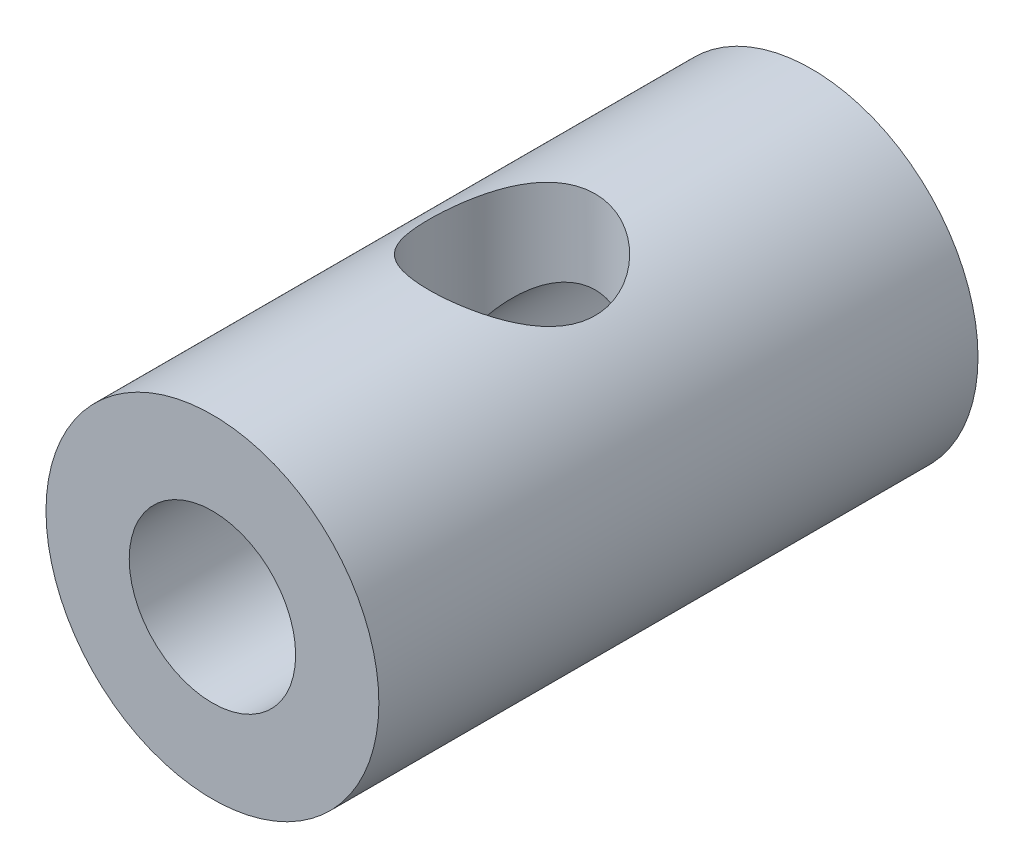
ISO-10303-21;
HEADER;
FILE_DESCRIPTION(('STEP AP214'),'2;1');
FILE_NAME('part.step','',(''),(''),'','','');
FILE_SCHEMA(('AUTOMOTIVE_DESIGN { 1 0 10303 214 1 1 1 1 }'));
ENDSEC;
DATA;
#1=APPLICATION_CONTEXT('core data for automotive mechanical design processes');
#2=APPLICATION_PROTOCOL_DEFINITION('international standard','automotive_design',2000,#1);
#3=PRODUCT_CONTEXT('',#1,'mechanical');
#4=PRODUCT('Part','Part','',(#3));
#5=PRODUCT_RELATED_PRODUCT_CATEGORY('part','',(#4));
#6=PRODUCT_DEFINITION_FORMATION('','',#4);
#7=PRODUCT_DEFINITION_CONTEXT('part definition',#1,'design');
#8=PRODUCT_DEFINITION('design','',#6,#7);
#9=PRODUCT_DEFINITION_SHAPE('','',#8);
#10=(LENGTH_UNIT() NAMED_UNIT(*) SI_UNIT(.MILLI.,.METRE.));
#11=(NAMED_UNIT(*) PLANE_ANGLE_UNIT() SI_UNIT($,.RADIAN.));
#12=(NAMED_UNIT(*) SI_UNIT($,.STERADIAN.) SOLID_ANGLE_UNIT());
#13=UNCERTAINTY_MEASURE_WITH_UNIT(LENGTH_MEASURE(1.E-05),#10,'distance_accuracy_value','');
#14=(GEOMETRIC_REPRESENTATION_CONTEXT(3) GLOBAL_UNCERTAINTY_ASSIGNED_CONTEXT((#13)) GLOBAL_UNIT_ASSIGNED_CONTEXT((#10,
#11,#12)) REPRESENTATION_CONTEXT('',''));
#15=CARTESIAN_POINT('',(0.,0.,0.));
#16=DIRECTION('',(0.,0.,1.));
#17=DIRECTION('',(1.,0.,0.));
#18=AXIS2_PLACEMENT_3D('',#15,#16,#17);
#19=CARTESIAN_POINT('',(0.,0.,90.));
#20=DIRECTION('',(0.,0.,-1.));
#21=DIRECTION('',(-1.,0.,0.));
#22=AXIS2_PLACEMENT_3D('',#19,#20,#21);
#23=CYLINDRICAL_SURFACE('',#22,25.);
#24=CARTESIAN_POINT('',(0.,0.,0.));
#25=DIRECTION('',(0.,0.707106781186548,-0.707106781186547));
#26=DIRECTION('',(0.,-0.707106781186548,-0.707106781186547));
#27=AXIS2_PLACEMENT_3D('',#24,#25,#26);
#28=ELLIPSE('',#27,35.3553390593274,25.);
#29=CARTESIAN_POINT('',(25.,0.,0.));
#30=VERTEX_POINT('',#29);
#31=CARTESIAN_POINT('',(-25.,0.,0.));
#32=VERTEX_POINT('',#31);
#33=EDGE_CURVE('E11',#30,#32,#28,.F.);
#34=ORIENTED_EDGE('',*,*,#33,.F.);
#35=CARTESIAN_POINT('',(0.,0.,0.));
#36=DIRECTION('',(0.,-0.707106781186548,-0.707106781186547));
#37=DIRECTION('',(0.,0.707106781186548,-0.707106781186547));
#38=AXIS2_PLACEMENT_3D('',#35,#36,#37);
#39=ELLIPSE('',#38,35.3553390593274,25.);
#40=EDGE_CURVE('E54',#32,#30,#39,.F.);
#41=ORIENTED_EDGE('',*,*,#40,.F.);
#42=EDGE_LOOP('',(#34,#41));
#43=FACE_BOUND('',#42,.T.);
#44=CARTESIAN_POINT('',(0.,0.,90.));
#45=DIRECTION('',(0.,0.,1.));
#46=DIRECTION('',(1.,0.,0.));
#47=AXIS2_PLACEMENT_3D('',#44,#45,#46);
#48=CIRCLE('',#47,25.);
#49=CARTESIAN_POINT('',(25.,0.,90.));
#50=VERTEX_POINT('',#49);
#51=EDGE_CURVE('E77',#50,#50,#48,.T.);
#52=ORIENTED_EDGE('',*,*,#51,.T.);
#53=EDGE_LOOP('',(#52));
#54=FACE_BOUND('',#53,.T.);
#55=ADVANCED_FACE('F39',(#43,#54),#23,.F.);
#56=CARTESIAN_POINT('',(0.,0.,90.));
#57=DIRECTION('',(0.,0.,1.));
#58=DIRECTION('',(1.,0.,0.));
#59=AXIS2_PLACEMENT_3D('',#56,#57,#58);
#60=PLANE('',#59);
#61=CARTESIAN_POINT('',(0.,0.,90.));
#62=DIRECTION('',(0.,0.,1.));
#63=DIRECTION('',(1.,0.,0.));
#64=AXIS2_PLACEMENT_3D('',#61,#62,#63);
#65=CIRCLE('',#64,50.);
#66=CARTESIAN_POINT('',(50.,0.,90.));
#67=VERTEX_POINT('',#66);
#68=EDGE_CURVE('E68',#67,#67,#65,.T.);
#69=ORIENTED_EDGE('',*,*,#68,.T.);
#70=EDGE_LOOP('',(#69));
#71=FACE_BOUND('',#70,.T.);
#72=ORIENTED_EDGE('',*,*,#51,.F.);
#73=EDGE_LOOP('',(#72));
#74=FACE_BOUND('',#73,.T.);
#75=ADVANCED_FACE('F102',(#71,#74),#60,.T.);
#76=CARTESIAN_POINT('',(0.,0.,-90.));
#77=DIRECTION('',(0.,0.,1.));
#78=DIRECTION('',(1.,0.,0.));
#79=AXIS2_PLACEMENT_3D('',#76,#77,#78);
#80=PLANE('',#79);
#81=CARTESIAN_POINT('',(0.,0.,-90.));
#82=DIRECTION('',(0.,0.,1.));
#83=DIRECTION('',(1.,0.,0.));
#84=AXIS2_PLACEMENT_3D('',#81,#82,#83);
#85=CIRCLE('',#84,50.);
#86=CARTESIAN_POINT('',(50.,0.,-90.));
#87=VERTEX_POINT('',#86);
#88=EDGE_CURVE('E74',#87,#87,#85,.T.);
#89=ORIENTED_EDGE('',*,*,#88,.F.);
#90=EDGE_LOOP('',(#89));
#91=FACE_BOUND('',#90,.T.);
#92=CARTESIAN_POINT('',(0.,0.,-90.));
#93=DIRECTION('',(0.,0.,1.));
#94=DIRECTION('',(1.,0.,0.));
#95=AXIS2_PLACEMENT_3D('',#92,#93,#94);
#96=CIRCLE('',#95,25.);
#97=CARTESIAN_POINT('',(25.,0.,-90.));
#98=VERTEX_POINT('',#97);
#99=EDGE_CURVE('E80',#98,#98,#96,.T.);
#100=ORIENTED_EDGE('',*,*,#99,.T.);
#101=EDGE_LOOP('',(#100));
#102=FACE_BOUND('',#101,.T.);
#103=ADVANCED_FACE('F104',(#91,#102),#80,.F.);
#104=CARTESIAN_POINT('',(0.,0.,90.));
#105=DIRECTION('',(0.,0.,-1.));
#106=DIRECTION('',(-1.,0.,0.));
#107=AXIS2_PLACEMENT_3D('',#104,#105,#106);
#108=CYLINDRICAL_SURFACE('',#107,50.);
#109=CARTESIAN_POINT('',(0.,-50.,25.));
#110=CARTESIAN_POINT('',(0.657444369159873,-49.9999980025819,24.9999978279489));
#111=CARTESIAN_POINT('',(1.31493470496087,-49.9870027092108,24.9740362150273));
#112=CARTESIAN_POINT('',(2.6250730777355,-49.9353488385963,24.8704854379624));
#113=CARTESIAN_POINT('',(3.27771888320609,-49.8966790970169,24.7928738141757));
#114=CARTESIAN_POINT('',(4.57408065163134,-49.7945905572767,24.5867702234871));
#115=CARTESIAN_POINT('',(5.21777972376392,-49.7311301865926,24.4581927843676));
#116=CARTESIAN_POINT('',(6.49045456812596,-49.5810908627757,24.1516544666022));
#117=CARTESIAN_POINT('',(7.11943180602178,-49.4945142217765,23.9736985268187));
#118=CARTESIAN_POINT('',(8.35617092779298,-49.3007575557992,23.5710774874016));
#119=CARTESIAN_POINT('',(8.96400616933616,-49.1936594417218,23.3465978046547));
#120=CARTESIAN_POINT('',(10.1574607752003,-48.9611646979654,22.8526392224996));
#121=CARTESIAN_POINT('',(10.7430796608687,-48.8357676743171,22.5831593542351));
#122=CARTESIAN_POINT('',(11.8888881177517,-48.5695403668689,22.0015245010171));
#123=CARTESIAN_POINT('',(12.4490824632761,-48.4287129977335,21.6893775727701));
#124=CARTESIAN_POINT('',(13.5415184091518,-48.1346789595441,21.0246560262042));
#125=CARTESIAN_POINT('',(14.0737590132777,-47.9814718497898,20.672079968481));
#126=CARTESIAN_POINT('',(15.1392859665099,-47.6563818983727,19.9062330158883));
#127=CARTESIAN_POINT('',(15.6706879740022,-47.4839299524032,19.4905807492081));
#128=CARTESIAN_POINT('',(16.6970261811053,-47.1328290302395,18.618881073027));
#129=CARTESIAN_POINT('',(17.1919611237406,-46.9541798407459,18.1628322722987));
#130=CARTESIAN_POINT('',(18.1435202870987,-46.5947579058659,17.212353289657));
#131=CARTESIAN_POINT('',(18.6001171792375,-46.4139837486385,16.7178962044052));
#132=CARTESIAN_POINT('',(19.2541986500252,-46.1446800125306,15.9495770175483));
#133=CARTESIAN_POINT('',(19.4670989156946,-46.0552177597499,15.6890195564912));
#134=CARTESIAN_POINT('',(19.8824542107625,-45.8774351376322,15.1592003071788));
#135=CARTESIAN_POINT('',(20.084906147519,-45.7891151121192,14.8899359796706));
#136=CARTESIAN_POINT('',(20.7066416715529,-45.5131934784761,14.0272058155975));
#137=CARTESIAN_POINT('',(21.1063416502074,-45.3287211433532,13.4184311063821));
#138=CARTESIAN_POINT('',(21.852630861188,-44.9736967688951,12.165287950449));
#139=CARTESIAN_POINT('',(22.1992234621,-44.8031438469765,11.5209217648187));
#140=CARTESIAN_POINT('',(22.6768446918049,-44.5622316685824,10.5306714143483));
#141=CARTESIAN_POINT('',(22.8290009934363,-44.4844171192112,10.1966540537464));
#142=CARTESIAN_POINT('',(23.1188386625452,-44.3344774413738,9.52125737061093));
#143=CARTESIAN_POINT('',(23.2565236954381,-44.2623508733648,9.17987993883208));
#144=CARTESIAN_POINT('',(23.6473153388962,-44.055551313526,8.14540003349584));
#145=CARTESIAN_POINT('',(23.8782374901442,-43.9304181127329,7.44178647357895));
#146=CARTESIAN_POINT('',(24.265648147422,-43.7175508072576,6.05518427798215));
#147=CARTESIAN_POINT('',(24.4257608226152,-43.6280282814747,5.37347682694633));
#148=CARTESIAN_POINT('',(24.6885773977117,-43.4798461113618,3.99571637194261));
#149=CARTESIAN_POINT('',(24.7912837533692,-43.4211851468278,3.29966398295016));
#150=CARTESIAN_POINT('',(24.9376202697234,-43.3373078356146,1.89996148072838));
#151=CARTESIAN_POINT('',(24.9813003991746,-43.3120632006542,1.19631830285586));
#152=CARTESIAN_POINT('',(25.0090197920334,-43.2960650987465,-0.212505715869532));
#153=CARTESIAN_POINT('',(24.9930647456981,-43.3053083410419,-0.917686403599694));
#154=CARTESIAN_POINT('',(24.907282322506,-43.3546908559143,-2.23864352747948));
#155=CARTESIAN_POINT('',(24.8441358688886,-43.3909972549122,-2.85501252640902));
#156=CARTESIAN_POINT('',(24.6726746663574,-43.4887211748338,-4.07935654569769));
#157=CARTESIAN_POINT('',(24.5643641561101,-43.5501363392784,-4.68733234823166));
#158=CARTESIAN_POINT('',(24.3037964141712,-43.696083535536,-5.89108353186032));
#159=CARTESIAN_POINT('',(24.1515281726087,-43.7806213584855,-6.48685581631564));
#160=CARTESIAN_POINT('',(23.8046322868205,-43.9702001419617,-7.66258494984019));
#161=CARTESIAN_POINT('',(23.610002386244,-44.0752421945946,-8.24254095461903));
#162=CARTESIAN_POINT('',(23.1752046510398,-44.3054368685814,-9.39675041468361));
#163=CARTESIAN_POINT('',(22.9340930150432,-44.4309962102225,-9.97056645597036));
#164=CARTESIAN_POINT('',(22.4112245879752,-44.6970138173574,-11.0960462662337));
#165=CARTESIAN_POINT('',(22.1294506873307,-44.8374783479304,-11.6477005846208));
#166=CARTESIAN_POINT('',(21.527201226818,-45.1297198063367,-12.7263992686878));
#167=CARTESIAN_POINT('',(21.2067208145856,-45.2814981515888,-13.2534405372939));
#168=CARTESIAN_POINT('',(20.5288955152035,-45.5928014582606,-14.2808713223056));
#169=CARTESIAN_POINT('',(20.1715476748342,-45.7523270397203,-14.7812586987584));
#170=CARTESIAN_POINT('',(19.3741259189533,-46.0961480022329,-15.8152404336728));
#171=CARTESIAN_POINT('',(18.9293084176779,-46.2810182012171,-16.3449935087139));
#172=CARTESIAN_POINT('',(17.9974283114299,-46.6513018738783,-17.3657779827118));
#173=CARTESIAN_POINT('',(17.5103625876535,-46.8367153866853,-17.8568065178691));
#174=CARTESIAN_POINT('',(16.496135256007,-47.2034787030071,-18.797771701967));
#175=CARTESIAN_POINT('',(15.9689550696147,-47.3848265726115,-19.2476890958681));
#176=CARTESIAN_POINT('',(14.8772179390845,-47.7388487701634,-20.1034685836406));
#177=CARTESIAN_POINT('',(14.312660725113,-47.9115230354781,-20.5093303594081));
#178=CARTESIAN_POINT('',(13.1218191510406,-48.2516201026665,-21.2919897073894));
#179=CARTESIAN_POINT('',(12.4938843565152,-48.4184234028208,-21.6665521268372));
#180=CARTESIAN_POINT('',(11.2038249606086,-48.7331003789285,-22.3609230803332));
#181=CARTESIAN_POINT('',(10.5416987689301,-48.8809731732785,-22.6807290645799));
#182=CARTESIAN_POINT('',(9.18815056537438,-49.1533730811518,-23.2619857608396));
#183=CARTESIAN_POINT('',(8.49674751524764,-49.2779150301832,-23.5234735762303));
#184=CARTESIAN_POINT('',(7.08955661379598,-49.499952549828,-23.9851269465908));
#185=CARTESIAN_POINT('',(6.37377157817823,-49.5974512316721,-24.1852995559313));
#186=CARTESIAN_POINT('',(4.98400205182939,-49.755478292356,-24.5076646531683));
#187=CARTESIAN_POINT('',(4.31146646221863,-49.8184001034943,-24.6349431079336));
#188=CARTESIAN_POINT('',(2.95626486004928,-49.9171506366645,-24.8340378946937));
#189=CARTESIAN_POINT('',(2.2735994005716,-49.9529808323625,-24.9058572434274));
#190=CARTESIAN_POINT('',(0.904053632648821,-49.9965190230439,-24.9930658038279));
#191=CARTESIAN_POINT('',(0.21717511951397,-50.0042382620256,-25.0084775777657));
#192=CARTESIAN_POINT('',(-1.15523822176525,-49.9913618292939,-24.9827220239793));
#193=CARTESIAN_POINT('',(-1.84077310803101,-49.9707674106832,-24.9415572002156));
#194=CARTESIAN_POINT('',(-3.15173942864198,-49.9045428338411,-24.8085948696556));
#195=CARTESIAN_POINT('',(-3.77770529409282,-49.8609803598899,-24.7209761539276));
#196=CARTESIAN_POINT('',(-5.01925848244735,-49.7513352859145,-24.49907492608));
#197=CARTESIAN_POINT('',(-5.63484647045874,-49.6852541348922,-24.3647954164159));
#198=CARTESIAN_POINT('',(-6.8517107190379,-49.5321127404684,-24.0509653397622));
#199=CARTESIAN_POINT('',(-7.45298618161211,-49.445051330311,-23.8714122549886));
#200=CARTESIAN_POINT('',(-8.63762867196298,-49.2519198169311,-23.4687621599592));
#201=CARTESIAN_POINT('',(-9.22099494609105,-49.1458489150383,-23.2456633201241));
#202=CARTESIAN_POINT('',(-10.382998931141,-48.913743693628,-22.7508989458207));
#203=CARTESIAN_POINT('',(-10.9610268909325,-48.7872261524874,-22.4780293898542));
#204=CARTESIAN_POINT('',(-12.0918113151844,-48.5193340099407,-21.8905028221052));
#205=CARTESIAN_POINT('',(-12.6445675575442,-48.3779592779982,-21.5758454431652));
#206=CARTESIAN_POINT('',(-13.7224372496012,-48.0833337758769,-20.9068693660781));
#207=CARTESIAN_POINT('',(-14.2475418897947,-47.9300792589091,-20.5525381393284));
#208=CARTESIAN_POINT('',(-15.2677326168219,-47.6149288305495,-19.8064580177859));
#209=CARTESIAN_POINT('',(-15.7628164018112,-47.4530322583146,-19.4147062596953));
#210=CARTESIAN_POINT('',(-16.7680615176203,-47.1077653744917,-18.5556217226548));
#211=CARTESIAN_POINT('',(-17.2749260642373,-46.9238479498425,-18.0846446969834));
#212=CARTESIAN_POINT('',(-18.2476062828922,-46.554222717342,-17.1027066620202));
#213=CARTESIAN_POINT('',(-18.7134194186761,-46.368514799655,-16.5917431859472));
#214=CARTESIAN_POINT('',(-19.6019775853604,-45.9999341018726,-15.5319295873275));
#215=CARTESIAN_POINT('',(-20.0246933985923,-45.8170633154805,-14.9830541798934));
#216=CARTESIAN_POINT('',(-20.6242149022334,-45.5487622797303,-14.1337149489303));
#217=CARTESIAN_POINT('',(-20.8183024407612,-45.4603266849287,-13.8462544305392));
#218=CARTESIAN_POINT('',(-21.1947489553944,-45.2860424566792,-13.262849435088));
#219=CARTESIAN_POINT('',(-21.3771040579976,-45.2001946825299,-12.9669022022604));
#220=CARTESIAN_POINT('',(-21.9230700779765,-44.9393684395693,-12.0379061608291));
#221=CARTESIAN_POINT('',(-22.2661651332543,-44.7698808359186,-11.3910679833595));
#222=CARTESIAN_POINT('',(-22.8958621141685,-44.4511441244921,-10.0656627776518));
#223=CARTESIAN_POINT('',(-23.1824702977131,-44.3018927754115,-9.38709927442624));
#224=CARTESIAN_POINT('',(-23.5674698327776,-44.0975665321614,-8.34928226250837));
#225=CARTESIAN_POINT('',(-23.6882891545696,-44.0327321437918,-8.00011829732394));
#226=CARTESIAN_POINT('',(-23.9146296330853,-43.9102159696853,-7.29570214249012));
#227=CARTESIAN_POINT('',(-24.0201547364268,-43.8525323392789,-6.94045155002614));
#228=CARTESIAN_POINT('',(-24.2155549938939,-43.7449351296128,-6.22451357774649));
#229=CARTESIAN_POINT('',(-24.3054305218022,-43.6950213647765,-5.86382632800641));
#230=CARTESIAN_POINT('',(-24.4691950146116,-43.6035233182928,-5.13780554130976));
#231=CARTESIAN_POINT('',(-24.5430833397775,-43.5619393699718,-4.77247181904159));
#232=CARTESIAN_POINT('',(-24.7276588661954,-43.4575872221013,-3.74130620157303));
#233=CARTESIAN_POINT('',(-24.8198883405912,-43.4048241783723,-3.07101728004698));
#234=CARTESIAN_POINT('',(-24.9497004116163,-43.330336140383,-1.72356668717391));
#235=CARTESIAN_POINT('',(-24.9872867246759,-43.3086090352857,-1.04640548638408));
#236=CARTESIAN_POINT('',(-25.0072719996239,-43.2970726371582,0.308775448683252));
#237=CARTESIAN_POINT('',(-24.9896913738163,-43.3072515385937,0.986794772646095));
#238=CARTESIAN_POINT('',(-24.8996480527879,-43.3590845544957,2.33793252114666));
#239=CARTESIAN_POINT('',(-24.8271876043223,-43.4007373804338,3.01105114517789));
#240=CARTESIAN_POINT('',(-24.6379744662866,-43.5083984770627,4.28290970715562));
#241=CARTESIAN_POINT('',(-24.5261097308544,-43.5717024817241,4.88261641950773));
#242=CARTESIAN_POINT('',(-24.2596436355718,-43.7206240337343,6.06956457216048));
#243=CARTESIAN_POINT('',(-24.1050456807422,-43.8062398032307,6.65680700161354));
#244=CARTESIAN_POINT('',(-23.7546180007228,-43.9972486946394,7.81567006166026));
#245=CARTESIAN_POINT('',(-23.5587786599644,-44.1026464281592,8.38728701394447));
#246=CARTESIAN_POINT('',(-23.1275899382195,-44.3302828861753,9.51195842048543));
#247=CARTESIAN_POINT('',(-22.892237944024,-44.4525227244452,10.0650116441066));
#248=CARTESIAN_POINT('',(-22.3667072736874,-44.7193800221364,11.1865646450665));
#249=CARTESIAN_POINT('',(-22.0739092056014,-44.8649486904602,11.7536103768769));
#250=CARTESIAN_POINT('',(-21.4473851131872,-45.1678061315087,12.8613635379996));
#251=CARTESIAN_POINT('',(-21.1136554262468,-45.325095952562,13.402068604259));
#252=CARTESIAN_POINT('',(-20.407126352388,-45.6475630197623,14.4551509369122));
#253=CARTESIAN_POINT('',(-20.0343116192861,-45.8127433500439,14.9675169548605));
#254=CARTESIAN_POINT('',(-19.2515987475897,-46.1471242371181,15.9617126936689));
#255=CARTESIAN_POINT('',(-18.8416984648874,-46.3163250259368,16.443540646223));
#256=CARTESIAN_POINT('',(-17.9345967959593,-46.6756489038468,17.4313764323322));
#257=CARTESIAN_POINT('',(-17.4328408840099,-46.8658138009145,17.9331979104683));
#258=CARTESIAN_POINT('',(-16.3875037408537,-47.2414881976917,18.8932095909724));
#259=CARTESIAN_POINT('',(-15.8439189431759,-47.4269972986401,19.3513960654044));
#260=CARTESIAN_POINT('',(-14.717334362054,-47.7885990943092,20.2214455880496));
#261=CARTESIAN_POINT('',(-14.1343114723886,-47.9646861586846,20.6332810968718));
#262=CARTESIAN_POINT('',(-12.9322386026572,-48.3026596395833,21.4071978138365));
#263=CARTESIAN_POINT('',(-12.3131907014039,-48.4645468741545,21.7692818888263));
#264=CARTESIAN_POINT('',(-11.038055993891,-48.7708340241157,22.4429257394822));
#265=CARTESIAN_POINT('',(-10.3817358840444,-48.915100542885,22.7541055132707));
#266=CARTESIAN_POINT('',(-9.04037008445452,-49.1806781620305,23.3195507312133));
#267=CARTESIAN_POINT('',(-8.35532029581232,-49.3019859731554,23.5738080211423));
#268=CARTESIAN_POINT('',(-6.96348625672909,-49.5177193948278,24.0217187559419));
#269=CARTESIAN_POINT('',(-6.25676109261156,-49.6122119418058,24.2155232257574));
#270=CARTESIAN_POINT('',(-4.82618305553358,-49.7717321819833,24.5406902191554));
#271=CARTESIAN_POINT('',(-4.10234092970566,-49.8367778727304,24.6720908855716));
#272=CARTESIAN_POINT('',(-2.815208808083,-49.9238191657207,24.8473722598489));
#273=CARTESIAN_POINT('',(-2.25412920008672,-49.9523370217385,24.904558666068));
#274=CARTESIAN_POINT('',(-1.12871107881109,-49.9904285576472,24.9808739936456));
#275=CARTESIAN_POINT('',(-0.564372476012346,-50.0000017146512,25.0000018645621));
#276=CARTESIAN_POINT('',(0.,-50.,25.));
#277=B_SPLINE_CURVE_WITH_KNOTS('',3,(#109,#110,#111,#112,#113,#114,#115,#116,#117,#118,#119,
#120,#121,#122,#123,#124,#125,#126,#127,#128,#129,#130,#131,#132,#133,#134,#135,#136,#137,#138,
#139,#140,#141,#142,#143,#144,#145,#146,#147,#148,#149,#150,#151,#152,#153,#154,#155,#156,#157,
#158,#159,#160,#161,#162,#163,#164,#165,#166,#167,#168,#169,#170,#171,#172,#173,#174,#175,#176,
#177,#178,#179,#180,#181,#182,#183,#184,#185,#186,#187,#188,#189,#190,#191,#192,#193,#194,#195,
#196,#197,#198,#199,#200,#201,#202,#203,#204,#205,#206,#207,#208,#209,#210,#211,#212,#213,#214,
#215,#216,#217,#218,#219,#220,#221,#222,#223,#224,#225,#226,#227,#228,#229,#230,#231,#232,#233,
#234,#235,#236,#237,#238,#239,#240,#241,#242,#243,#244,#245,#246,#247,#248,#249,#250,#251,#252,
#253,#254,#255,#256,#257,#258,#259,#260,#261,#262,#263,#264,#265,#266,#267,#268,#269,#270,#271,
#272,#273,#274,#275,#276),.UNSPECIFIED.,.T.,.F.,(4,2,2,2,2,2,2,2,2,2,2,2,2,2,2,2,2,2,2,2,2,2,2,
2,2,2,2,2,2,2,2,2,2,2,2,2,2,2,2,2,2,2,2,2,2,2,2,2,2,2,2,2,2,2,2,2,2,2,2,2,2,2,2,2,2,2,2,2,2,2,2,
2,2,2,2,2,2,2,2,2,2,2,2,4),(0.,1.97177647312672,3.94441092009879,5.92036766597605,
7.89612684686162,9.86415820257361,11.8322319355671,13.7999345545384,15.7677072516863,
17.8545139057195,19.941392455828,22.0297461889264,23.0740156291936,24.1185924146623,
26.3694397167534,28.6201441890873,29.7453905754802,30.8703512588122,33.1197167896587,
35.2346267573422,37.349446245496,39.4624743056182,41.5753007504117,43.4350827089855,
45.2946901654813,47.1547637931692,49.014936520045,50.9178621103311,52.8215907472455,
54.7255582894835,56.6296784652712,58.7753747651432,60.9212295973755,63.068084376816,
65.2149546565969,67.4618500797949,69.7088501040356,71.9544164302338,74.1997243048456,
76.2590423352928,78.3182483397222,80.3766305993834,82.4349217623312,84.3334241910171,
86.231804480463,88.13029036718,90.0288560361493,91.9815881774274,93.9343374769978,
95.8877051836998,97.8412224756721,99.9866509386849,102.132211858591,104.279217814074,
105.352790499999,106.426715829659,108.678274392205,110.929583375043,112.054588590097,
113.179302982784,114.30399050852,115.428723030818,117.461588136567,119.494314975148,
121.526289773722,123.558181388661,125.396125658234,127.233923520968,129.072150347832,
130.910498795599,132.872214089485,134.834105048343,136.79676922119,138.759546938433,
140.961041707857,143.162724392535,145.365708375521,147.56856536178,149.787182365171,
152.006116985464,154.219462961763,156.431454336489,158.124047214681,159.816686808969),.UNSPECIFIED.);
#278=CARTESIAN_POINT('',(0.,-50.,25.));
#279=VERTEX_POINT('',#278);
#280=EDGE_CURVE('E83',#279,#279,#277,.T.);
#281=ORIENTED_EDGE('',*,*,#280,.T.);
#282=EDGE_LOOP('',(#281));
#283=FACE_BOUND('',#282,.T.);
#284=CARTESIAN_POINT('',(0.,50.,25.));
#285=CARTESIAN_POINT('',(-0.657444369159873,49.9999980025819,24.9999978279489));
#286=CARTESIAN_POINT('',(-1.31493470496087,49.9870027092108,24.9740362150273));
#287=CARTESIAN_POINT('',(-2.62507307773551,49.9353488385963,24.8704854379624));
#288=CARTESIAN_POINT('',(-3.2777188832061,49.8966790970169,24.7928738141757));
#289=CARTESIAN_POINT('',(-4.57408065163134,49.7945905572767,24.5867702234871));
#290=CARTESIAN_POINT('',(-5.21777972376392,49.7311301865926,24.4581927843676));
#291=CARTESIAN_POINT('',(-6.49045456812596,49.5810908627757,24.1516544666022));
#292=CARTESIAN_POINT('',(-7.11943180602179,49.4945142217765,23.9736985268187));
#293=CARTESIAN_POINT('',(-8.35617092779298,49.3007575557992,23.5710774874016));
#294=CARTESIAN_POINT('',(-8.96400616933617,49.1936594417218,23.3465978046547));
#295=CARTESIAN_POINT('',(-10.1574607752003,48.9611646979654,22.8526392224996));
#296=CARTESIAN_POINT('',(-10.7430796608687,48.8357676743171,22.5831593542351));
#297=CARTESIAN_POINT('',(-11.8888881177517,48.5695403668689,22.0015245010171));
#298=CARTESIAN_POINT('',(-12.4490824632761,48.4287129977335,21.6893775727701));
#299=CARTESIAN_POINT('',(-13.5415184091518,48.1346789595441,21.0246560262042));
#300=CARTESIAN_POINT('',(-14.0737590132777,47.9814718497898,20.672079968481));
#301=CARTESIAN_POINT('',(-15.1392859665099,47.6563818983727,19.9062330158883));
#302=CARTESIAN_POINT('',(-15.6706879740022,47.4839299524032,19.4905807492081));
#303=CARTESIAN_POINT('',(-16.6970261811053,47.1328290302395,18.618881073027));
#304=CARTESIAN_POINT('',(-17.1919611237406,46.9541798407459,18.1628322722987));
#305=CARTESIAN_POINT('',(-18.1435202870987,46.5947579058659,17.212353289657));
#306=CARTESIAN_POINT('',(-18.6001171792375,46.4139837486385,16.7178962044052));
#307=CARTESIAN_POINT('',(-19.2541986500252,46.1446800125306,15.9495770175483));
#308=CARTESIAN_POINT('',(-19.4670989156946,46.0552177597499,15.6890195564912));
#309=CARTESIAN_POINT('',(-19.8824542107625,45.8774351376322,15.1592003071788));
#310=CARTESIAN_POINT('',(-20.084906147519,45.7891151121192,14.8899359796706));
#311=CARTESIAN_POINT('',(-20.7066416715529,45.5131934784761,14.0272058155975));
#312=CARTESIAN_POINT('',(-21.1063416502074,45.3287211433532,13.4184311063821));
#313=CARTESIAN_POINT('',(-21.852630861188,44.9736967688951,12.165287950449));
#314=CARTESIAN_POINT('',(-22.1992234621,44.8031438469765,11.5209217648187));
#315=CARTESIAN_POINT('',(-22.6768446918049,44.5622316685824,10.5306714143483));
#316=CARTESIAN_POINT('',(-22.8290009934363,44.4844171192112,10.1966540537464));
#317=CARTESIAN_POINT('',(-23.1188386625452,44.3344774413738,9.52125737061093));
#318=CARTESIAN_POINT('',(-23.2565236954381,44.2623508733648,9.17987993883208));
#319=CARTESIAN_POINT('',(-23.6473153388962,44.055551313526,8.14540003349584));
#320=CARTESIAN_POINT('',(-23.8782374901442,43.9304181127329,7.44178647357895));
#321=CARTESIAN_POINT('',(-24.265648147422,43.7175508072576,6.05518427798215));
#322=CARTESIAN_POINT('',(-24.4257608226152,43.6280282814747,5.37347682694633));
#323=CARTESIAN_POINT('',(-24.6885773977117,43.4798461113618,3.99571637194261));
#324=CARTESIAN_POINT('',(-24.7912837533692,43.4211851468278,3.29966398295016));
#325=CARTESIAN_POINT('',(-24.9376202697234,43.3373078356146,1.89996148072838));
#326=CARTESIAN_POINT('',(-24.9813003991746,43.3120632006542,1.19631830285586));
#327=CARTESIAN_POINT('',(-25.0090197920334,43.2960650987465,-0.212505715869532));
#328=CARTESIAN_POINT('',(-24.9930647456981,43.3053083410419,-0.917686403599694));
#329=CARTESIAN_POINT('',(-24.907282322506,43.3546908559143,-2.23864352747948));
#330=CARTESIAN_POINT('',(-24.8441358688886,43.3909972549122,-2.85501252640902));
#331=CARTESIAN_POINT('',(-24.6726746663574,43.4887211748338,-4.07935654569769));
#332=CARTESIAN_POINT('',(-24.5643641561101,43.5501363392784,-4.68733234823166));
#333=CARTESIAN_POINT('',(-24.3037964141712,43.696083535536,-5.89108353186032));
#334=CARTESIAN_POINT('',(-24.1515281726087,43.7806213584855,-6.48685581631564));
#335=CARTESIAN_POINT('',(-23.8046322868205,43.9702001419617,-7.66258494984019));
#336=CARTESIAN_POINT('',(-23.610002386244,44.0752421945946,-8.24254095461903));
#337=CARTESIAN_POINT('',(-23.1752046510398,44.3054368685814,-9.39675041468361));
#338=CARTESIAN_POINT('',(-22.9340930150432,44.4309962102225,-9.97056645597036));
#339=CARTESIAN_POINT('',(-22.4112245879752,44.6970138173574,-11.0960462662337));
#340=CARTESIAN_POINT('',(-22.1294506873307,44.8374783479304,-11.6477005846208));
#341=CARTESIAN_POINT('',(-21.527201226818,45.1297198063367,-12.7263992686878));
#342=CARTESIAN_POINT('',(-21.2067208145856,45.2814981515888,-13.2534405372939));
#343=CARTESIAN_POINT('',(-20.5288955152035,45.5928014582606,-14.2808713223056));
#344=CARTESIAN_POINT('',(-20.1715476748342,45.7523270397203,-14.7812586987584));
#345=CARTESIAN_POINT('',(-19.3741259189533,46.0961480022329,-15.8152404336728));
#346=CARTESIAN_POINT('',(-18.9293084176779,46.2810182012171,-16.3449935087139));
#347=CARTESIAN_POINT('',(-17.9974283114299,46.6513018738783,-17.3657779827118));
#348=CARTESIAN_POINT('',(-17.5103625876535,46.8367153866853,-17.8568065178691));
#349=CARTESIAN_POINT('',(-16.496135256007,47.2034787030071,-18.797771701967));
#350=CARTESIAN_POINT('',(-15.9689550696147,47.3848265726115,-19.2476890958681));
#351=CARTESIAN_POINT('',(-14.8772179390845,47.7388487701634,-20.1034685836406));
#352=CARTESIAN_POINT('',(-14.312660725113,47.9115230354781,-20.5093303594081));
#353=CARTESIAN_POINT('',(-13.1218191510406,48.2516201026665,-21.2919897073894));
#354=CARTESIAN_POINT('',(-12.4938843565152,48.4184234028208,-21.6665521268372));
#355=CARTESIAN_POINT('',(-11.2038249606086,48.7331003789285,-22.3609230803332));
#356=CARTESIAN_POINT('',(-10.5416987689301,48.8809731732785,-22.6807290645799));
#357=CARTESIAN_POINT('',(-9.18815056537438,49.1533730811518,-23.2619857608396));
#358=CARTESIAN_POINT('',(-8.49674751524764,49.2779150301832,-23.5234735762303));
#359=CARTESIAN_POINT('',(-7.08955661379598,49.499952549828,-23.9851269465908));
#360=CARTESIAN_POINT('',(-6.37377157817823,49.5974512316721,-24.1852995559313));
#361=CARTESIAN_POINT('',(-4.98400205182939,49.755478292356,-24.5076646531683));
#362=CARTESIAN_POINT('',(-4.31146646221863,49.8184001034943,-24.6349431079336));
#363=CARTESIAN_POINT('',(-2.95626486004928,49.9171506366645,-24.8340378946937));
#364=CARTESIAN_POINT('',(-2.2735994005716,49.9529808323625,-24.9058572434274));
#365=CARTESIAN_POINT('',(-0.904053632648821,49.9965190230439,-24.9930658038279));
#366=CARTESIAN_POINT('',(-0.21717511951397,50.0042382620256,-25.0084775777657));
#367=CARTESIAN_POINT('',(1.15523822176525,49.9913618292939,-24.9827220239793));
#368=CARTESIAN_POINT('',(1.84077310803101,49.9707674106832,-24.9415572002156));
#369=CARTESIAN_POINT('',(3.15173942864198,49.9045428338411,-24.8085948696556));
#370=CARTESIAN_POINT('',(3.77770529409282,49.8609803598899,-24.7209761539276));
#371=CARTESIAN_POINT('',(5.01925848244735,49.7513352859145,-24.49907492608));
#372=CARTESIAN_POINT('',(5.63484647045874,49.6852541348922,-24.3647954164159));
#373=CARTESIAN_POINT('',(6.8517107190379,49.5321127404684,-24.0509653397622));
#374=CARTESIAN_POINT('',(7.45298618161211,49.445051330311,-23.8714122549886));
#375=CARTESIAN_POINT('',(8.63762867196298,49.2519198169311,-23.4687621599592));
#376=CARTESIAN_POINT('',(9.22099494609105,49.1458489150383,-23.2456633201241));
#377=CARTESIAN_POINT('',(10.382998931141,48.913743693628,-22.7508989458207));
#378=CARTESIAN_POINT('',(10.9610268909325,48.7872261524874,-22.4780293898542));
#379=CARTESIAN_POINT('',(12.0918113151844,48.5193340099407,-21.8905028221052));
#380=CARTESIAN_POINT('',(12.6445675575442,48.3779592779982,-21.5758454431652));
#381=CARTESIAN_POINT('',(13.7224372496012,48.0833337758769,-20.9068693660781));
#382=CARTESIAN_POINT('',(14.2475418897947,47.9300792589091,-20.5525381393284));
#383=CARTESIAN_POINT('',(15.2677326168219,47.6149288305495,-19.8064580177859));
#384=CARTESIAN_POINT('',(15.7628164018113,47.4530322583146,-19.4147062596953));
#385=CARTESIAN_POINT('',(16.7680615176203,47.1077653744917,-18.5556217226548));
#386=CARTESIAN_POINT('',(17.2749260642373,46.9238479498425,-18.0846446969834));
#387=CARTESIAN_POINT('',(18.2476062828922,46.554222717342,-17.1027066620202));
#388=CARTESIAN_POINT('',(18.7134194186761,46.368514799655,-16.5917431859472));
#389=CARTESIAN_POINT('',(19.6019775853604,45.9999341018726,-15.5319295873275));
#390=CARTESIAN_POINT('',(20.0246933985923,45.8170633154805,-14.9830541798934));
#391=CARTESIAN_POINT('',(20.6242149022334,45.5487622797303,-14.1337149489303));
#392=CARTESIAN_POINT('',(20.8183024407612,45.4603266849287,-13.8462544305392));
#393=CARTESIAN_POINT('',(21.1947489553944,45.2860424566792,-13.262849435088));
#394=CARTESIAN_POINT('',(21.3771040579976,45.2001946825299,-12.9669022022604));
#395=CARTESIAN_POINT('',(21.9230700779765,44.9393684395693,-12.0379061608291));
#396=CARTESIAN_POINT('',(22.2661651332543,44.7698808359186,-11.3910679833595));
#397=CARTESIAN_POINT('',(22.8958621141685,44.4511441244921,-10.0656627776518));
#398=CARTESIAN_POINT('',(23.1824702977131,44.3018927754115,-9.38709927442623));
#399=CARTESIAN_POINT('',(23.5674698327776,44.0975665321614,-8.34928226250837));
#400=CARTESIAN_POINT('',(23.6882891545696,44.0327321437918,-8.00011829732394));
#401=CARTESIAN_POINT('',(23.9146296330853,43.9102159696853,-7.29570214249012));
#402=CARTESIAN_POINT('',(24.0201547364268,43.8525323392789,-6.94045155002614));
#403=CARTESIAN_POINT('',(24.2155549938939,43.7449351296128,-6.22451357774649));
#404=CARTESIAN_POINT('',(24.3054305218022,43.6950213647765,-5.86382632800641));
#405=CARTESIAN_POINT('',(24.4691950146116,43.6035233182928,-5.13780554130976));
#406=CARTESIAN_POINT('',(24.5430833397775,43.5619393699718,-4.77247181904159));
#407=CARTESIAN_POINT('',(24.7276588661954,43.4575872221013,-3.74130620157303));
#408=CARTESIAN_POINT('',(24.8198883405912,43.4048241783723,-3.07101728004698));
#409=CARTESIAN_POINT('',(24.9497004116163,43.330336140383,-1.72356668717391));
#410=CARTESIAN_POINT('',(24.9872867246759,43.3086090352857,-1.04640548638408));
#411=CARTESIAN_POINT('',(25.0072719996239,43.2970726371582,0.308775448683252));
#412=CARTESIAN_POINT('',(24.9896913738163,43.3072515385937,0.986794772646095));
#413=CARTESIAN_POINT('',(24.8996480527879,43.3590845544957,2.33793252114666));
#414=CARTESIAN_POINT('',(24.8271876043223,43.4007373804338,3.01105114517789));
#415=CARTESIAN_POINT('',(24.6379744662866,43.5083984770627,4.28290970715562));
#416=CARTESIAN_POINT('',(24.5261097308544,43.5717024817241,4.88261641950773));
#417=CARTESIAN_POINT('',(24.2596436355718,43.7206240337343,6.06956457216048));
#418=CARTESIAN_POINT('',(24.1050456807422,43.8062398032307,6.65680700161354));
#419=CARTESIAN_POINT('',(23.7546180007228,43.9972486946394,7.81567006166026));
#420=CARTESIAN_POINT('',(23.5587786599644,44.1026464281592,8.38728701394447));
#421=CARTESIAN_POINT('',(23.1275899382195,44.3302828861753,9.51195842048543));
#422=CARTESIAN_POINT('',(22.892237944024,44.4525227244452,10.0650116441066));
#423=CARTESIAN_POINT('',(22.3667072736874,44.7193800221364,11.1865646450665));
#424=CARTESIAN_POINT('',(22.0739092056014,44.8649486904602,11.7536103768769));
#425=CARTESIAN_POINT('',(21.4473851131872,45.1678061315087,12.8613635379996));
#426=CARTESIAN_POINT('',(21.1136554262468,45.325095952562,13.402068604259));
#427=CARTESIAN_POINT('',(20.407126352388,45.6475630197623,14.4551509369122));
#428=CARTESIAN_POINT('',(20.0343116192861,45.8127433500439,14.9675169548605));
#429=CARTESIAN_POINT('',(19.2515987475897,46.1471242371181,15.9617126936689));
#430=CARTESIAN_POINT('',(18.8416984648874,46.3163250259368,16.443540646223));
#431=CARTESIAN_POINT('',(17.9345967959593,46.6756489038468,17.4313764323322));
#432=CARTESIAN_POINT('',(17.4328408840099,46.8658138009145,17.9331979104683));
#433=CARTESIAN_POINT('',(16.3875037408537,47.2414881976917,18.8932095909724));
#434=CARTESIAN_POINT('',(15.8439189431759,47.4269972986401,19.3513960654044));
#435=CARTESIAN_POINT('',(14.717334362054,47.7885990943092,20.2214455880496));
#436=CARTESIAN_POINT('',(14.1343114723886,47.9646861586846,20.6332810968718));
#437=CARTESIAN_POINT('',(12.9322386026572,48.3026596395833,21.4071978138365));
#438=CARTESIAN_POINT('',(12.3131907014039,48.4645468741545,21.7692818888263));
#439=CARTESIAN_POINT('',(11.038055993891,48.7708340241157,22.4429257394822));
#440=CARTESIAN_POINT('',(10.3817358840444,48.915100542885,22.7541055132707));
#441=CARTESIAN_POINT('',(9.04037008445451,49.1806781620305,23.3195507312133));
#442=CARTESIAN_POINT('',(8.35532029581232,49.3019859731554,23.5738080211423));
#443=CARTESIAN_POINT('',(6.96348625672909,49.5177193948278,24.0217187559419));
#444=CARTESIAN_POINT('',(6.25676109261156,49.6122119418058,24.2155232257574));
#445=CARTESIAN_POINT('',(4.82618305553358,49.7717321819833,24.5406902191554));
#446=CARTESIAN_POINT('',(4.10234092970566,49.8367778727304,24.6720908855716));
#447=CARTESIAN_POINT('',(2.815208808083,49.9238191657207,24.8473722598489));
#448=CARTESIAN_POINT('',(2.25412920008672,49.9523370217385,24.904558666068));
#449=CARTESIAN_POINT('',(1.12871107881109,49.9904285576472,24.9808739936456));
#450=CARTESIAN_POINT('',(0.564372476012346,50.0000017146512,25.0000018645621));
#451=CARTESIAN_POINT('',(0.,50.,25.));
#452=B_SPLINE_CURVE_WITH_KNOTS('',3,(#284,#285,#286,#287,#288,#289,#290,#291,#292,#293,#294,
#295,#296,#297,#298,#299,#300,#301,#302,#303,#304,#305,#306,#307,#308,#309,#310,#311,#312,#313,
#314,#315,#316,#317,#318,#319,#320,#321,#322,#323,#324,#325,#326,#327,#328,#329,#330,#331,#332,
#333,#334,#335,#336,#337,#338,#339,#340,#341,#342,#343,#344,#345,#346,#347,#348,#349,#350,#351,
#352,#353,#354,#355,#356,#357,#358,#359,#360,#361,#362,#363,#364,#365,#366,#367,#368,#369,#370,
#371,#372,#373,#374,#375,#376,#377,#378,#379,#380,#381,#382,#383,#384,#385,#386,#387,#388,#389,
#390,#391,#392,#393,#394,#395,#396,#397,#398,#399,#400,#401,#402,#403,#404,#405,#406,#407,#408,
#409,#410,#411,#412,#413,#414,#415,#416,#417,#418,#419,#420,#421,#422,#423,#424,#425,#426,#427,
#428,#429,#430,#431,#432,#433,#434,#435,#436,#437,#438,#439,#440,#441,#442,#443,#444,#445,#446,
#447,#448,#449,#450,#451),.UNSPECIFIED.,.T.,.F.,(4,2,2,2,2,2,2,2,2,2,2,2,2,2,2,2,2,2,2,2,2,2,2,
2,2,2,2,2,2,2,2,2,2,2,2,2,2,2,2,2,2,2,2,2,2,2,2,2,2,2,2,2,2,2,2,2,2,2,2,2,2,2,2,2,2,2,2,2,2,2,2,
2,2,2,2,2,2,2,2,2,2,2,2,4),(0.,1.97177647312672,3.94441092009879,5.92036766597606,
7.89612684686162,9.86415820257362,11.8322319355671,13.7999345545384,15.7677072516863,
17.8545139057195,19.941392455828,22.0297461889264,23.0740156291936,24.1185924146623,
26.3694397167534,28.6201441890873,29.7453905754802,30.8703512588122,33.1197167896587,
35.2346267573422,37.349446245496,39.4624743056183,41.5753007504117,43.4350827089855,
45.2946901654813,47.1547637931692,49.0149365200451,50.9178621103311,52.8215907472455,
54.7255582894835,56.6296784652712,58.7753747651432,60.9212295973755,63.068084376816,
65.2149546565969,67.4618500797949,69.7088501040356,71.9544164302338,74.1997243048457,
76.2590423352928,78.3182483397222,80.3766305993835,82.4349217623312,84.3334241910171,
86.2318044804631,88.1302903671801,90.0288560361493,91.9815881774274,93.9343374769978,
95.8877051836999,97.8412224756721,99.9866509386849,102.132211858591,104.279217814074,
105.352790499999,106.426715829659,108.678274392205,110.929583375043,112.054588590097,
113.179302982784,114.30399050852,115.428723030818,117.461588136567,119.494314975148,
121.526289773722,123.558181388661,125.396125658234,127.233923520968,129.072150347832,
130.910498795599,132.872214089485,134.834105048343,136.79676922119,138.759546938433,
140.961041707858,143.162724392535,145.365708375521,147.56856536178,149.787182365171,
152.006116985464,154.219462961763,156.431454336489,158.124047214681,159.816686808969),.UNSPECIFIED.);
#453=CARTESIAN_POINT('',(0.,50.,25.));
#454=VERTEX_POINT('',#453);
#455=EDGE_CURVE('E92',#454,#454,#452,.T.);
#456=ORIENTED_EDGE('',*,*,#455,.T.);
#457=EDGE_LOOP('',(#456));
#458=FACE_BOUND('',#457,.T.);
#459=ORIENTED_EDGE('',*,*,#68,.F.);
#460=EDGE_LOOP('',(#459));
#461=FACE_BOUND('',#460,.T.);
#462=ORIENTED_EDGE('',*,*,#88,.T.);
#463=EDGE_LOOP('',(#462));
#464=FACE_BOUND('',#463,.T.);
#465=ADVANCED_FACE('F41',(#283,#458,#461,#464),#108,.T.);
#466=CARTESIAN_POINT('',(0.,0.,0.));
#467=DIRECTION('',(0.,0.707106781186548,-0.707106781186547));
#468=DIRECTION('',(0.,-0.707106781186548,-0.707106781186547));
#469=AXIS2_PLACEMENT_3D('',#466,#467,#468);
#470=ELLIPSE('',#469,35.3553390593274,25.);
#471=EDGE_CURVE('E48',#30,#32,#470,.T.);
#472=ORIENTED_EDGE('',*,*,#471,.F.);
#473=CARTESIAN_POINT('',(0.,0.,0.));
#474=DIRECTION('',(0.,-0.707106781186548,-0.707106781186547));
#475=DIRECTION('',(0.,0.707106781186548,-0.707106781186547));
#476=AXIS2_PLACEMENT_3D('',#473,#474,#475);
#477=ELLIPSE('',#476,35.3553390593274,25.);
#478=EDGE_CURVE('E59',#32,#30,#477,.T.);
#479=ORIENTED_EDGE('',*,*,#478,.F.);
#480=EDGE_LOOP('',(#472,#479));
#481=FACE_BOUND('',#480,.T.);
#482=ORIENTED_EDGE('',*,*,#99,.F.);
#483=EDGE_LOOP('',(#482));
#484=FACE_BOUND('',#483,.T.);
#485=ADVANCED_FACE('F71',(#481,#484),#23,.F.);
#486=CARTESIAN_POINT('',(0.,-50.,0.));
#487=DIRECTION('',(0.,1.,0.));
#488=DIRECTION('',(0.,0.,1.));
#489=AXIS2_PLACEMENT_3D('',#486,#487,#488);
#490=CYLINDRICAL_SURFACE('',#489,25.);
#491=ORIENTED_EDGE('',*,*,#471,.T.);
#492=ORIENTED_EDGE('',*,*,#40,.T.);
#493=EDGE_LOOP('',(#491,#492));
#494=FACE_BOUND('',#493,.T.);
#495=ORIENTED_EDGE('',*,*,#280,.F.);
#496=EDGE_LOOP('',(#495));
#497=FACE_BOUND('',#496,.T.);
#498=ADVANCED_FACE('F66',(#494,#497),#490,.F.);
#499=ORIENTED_EDGE('',*,*,#33,.T.);
#500=ORIENTED_EDGE('',*,*,#478,.T.);
#501=EDGE_LOOP('',(#499,#500));
#502=FACE_BOUND('',#501,.T.);
#503=ORIENTED_EDGE('',*,*,#455,.F.);
#504=EDGE_LOOP('',(#503));
#505=FACE_BOUND('',#504,.T.);
#506=ADVANCED_FACE('F60',(#502,#505),#490,.F.);
#507=CLOSED_SHELL('',(#55,#75,#103,#465,#485,#498,#506));
#508=MANIFOLD_SOLID_BREP('B2',#507);
#509=ADVANCED_BREP_SHAPE_REPRESENTATION('',(#18,#508),#14);
#510=SHAPE_DEFINITION_REPRESENTATION(#9,#509);
ENDSEC;
END-ISO-10303-21;
